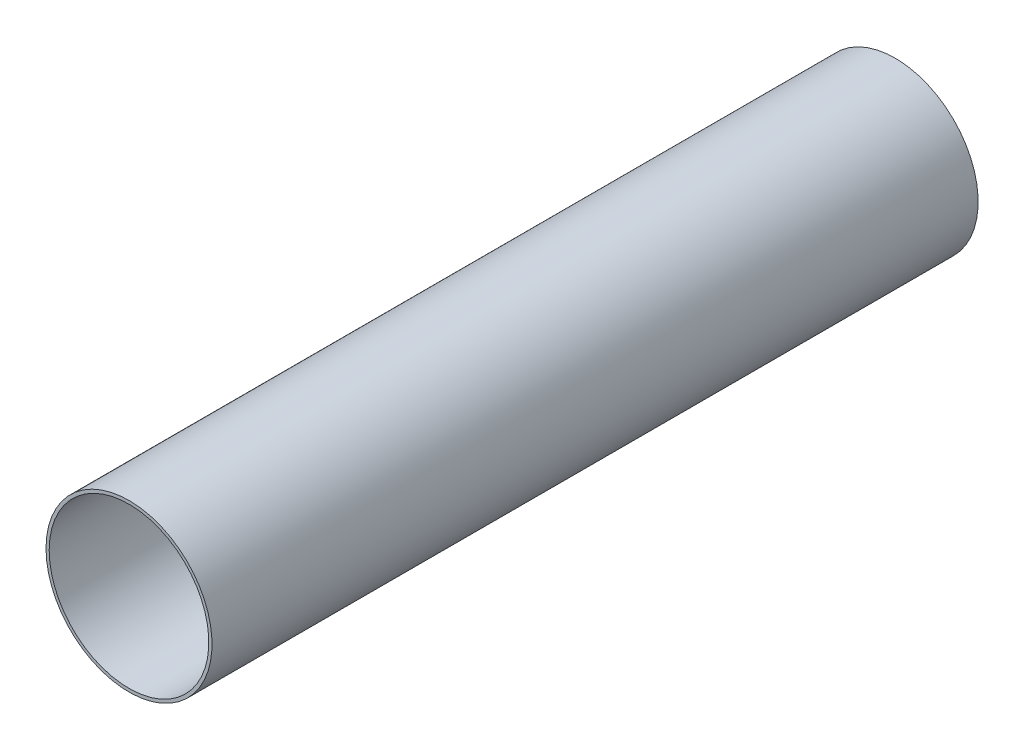
ISO-10303-21;
HEADER;
FILE_DESCRIPTION(('STEP AP214'),'2;1');
FILE_NAME('part.step','',(''),(''),'','','');
FILE_SCHEMA(('AUTOMOTIVE_DESIGN { 1 0 10303 214 1 1 1 1 }'));
ENDSEC;
DATA;
#1=APPLICATION_CONTEXT('core data for automotive mechanical design processes');
#2=APPLICATION_PROTOCOL_DEFINITION('international standard','automotive_design',2000,#1);
#3=PRODUCT_CONTEXT('',#1,'mechanical');
#4=PRODUCT('Part','Part','',(#3));
#5=PRODUCT_RELATED_PRODUCT_CATEGORY('part','',(#4));
#6=PRODUCT_DEFINITION_FORMATION('','',#4);
#7=PRODUCT_DEFINITION_CONTEXT('part definition',#1,'design');
#8=PRODUCT_DEFINITION('design','',#6,#7);
#9=PRODUCT_DEFINITION_SHAPE('','',#8);
#10=(LENGTH_UNIT() NAMED_UNIT(*) SI_UNIT(.MILLI.,.METRE.));
#11=(NAMED_UNIT(*) PLANE_ANGLE_UNIT() SI_UNIT($,.RADIAN.));
#12=(NAMED_UNIT(*) SI_UNIT($,.STERADIAN.) SOLID_ANGLE_UNIT());
#13=UNCERTAINTY_MEASURE_WITH_UNIT(LENGTH_MEASURE(1.E-05),#10,'distance_accuracy_value','');
#14=(GEOMETRIC_REPRESENTATION_CONTEXT(3) GLOBAL_UNCERTAINTY_ASSIGNED_CONTEXT((#13)) GLOBAL_UNIT_ASSIGNED_CONTEXT((#10,
#11,#12)) REPRESENTATION_CONTEXT('',''));
#15=CARTESIAN_POINT('',(0.,0.,0.));
#16=DIRECTION('',(0.,0.,1.));
#17=DIRECTION('',(1.,0.,0.));
#18=AXIS2_PLACEMENT_3D('',#15,#16,#17);
#19=CARTESIAN_POINT('',(0.,0.,60.));
#20=DIRECTION('',(0.,0.,1.));
#21=DIRECTION('',(1.,0.,0.));
#22=AXIS2_PLACEMENT_3D('',#19,#20,#21);
#23=PLANE('',#22);
#24=CARTESIAN_POINT('',(0.,0.,60.));
#25=DIRECTION('',(0.,0.,1.));
#26=DIRECTION('',(1.,0.,0.));
#27=AXIS2_PLACEMENT_3D('',#24,#25,#26);
#28=CIRCLE('',#27,13.);
#29=CARTESIAN_POINT('',(-13.,0.,60.));
#30=VERTEX_POINT('',#29);
#31=EDGE_CURVE('E10',#30,#30,#28,.T.);
#32=ORIENTED_EDGE('',*,*,#31,.T.);
#33=EDGE_LOOP('',(#32));
#34=FACE_BOUND('',#33,.T.);
#35=CARTESIAN_POINT('',(0.,0.,60.));
#36=DIRECTION('',(0.,0.,1.));
#37=DIRECTION('',(1.,0.,0.));
#38=AXIS2_PLACEMENT_3D('',#35,#36,#37);
#39=CIRCLE('',#38,12.5);
#40=CARTESIAN_POINT('',(-12.5,0.,60.));
#41=VERTEX_POINT('',#40);
#42=EDGE_CURVE('E52',#41,#41,#39,.T.);
#43=ORIENTED_EDGE('',*,*,#42,.F.);
#44=EDGE_LOOP('',(#43));
#45=FACE_BOUND('',#44,.T.);
#46=ADVANCED_FACE('F39',(#34,#45),#23,.T.);
#47=CARTESIAN_POINT('',(0.,0.,-60.));
#48=DIRECTION('',(0.,0.,1.));
#49=DIRECTION('',(1.,0.,0.));
#50=AXIS2_PLACEMENT_3D('',#47,#48,#49);
#51=PLANE('',#50);
#52=CARTESIAN_POINT('',(0.,0.,-60.));
#53=DIRECTION('',(0.,0.,1.));
#54=DIRECTION('',(1.,0.,0.));
#55=AXIS2_PLACEMENT_3D('',#52,#53,#54);
#56=CIRCLE('',#55,13.);
#57=CARTESIAN_POINT('',(-13.,0.,-60.));
#58=VERTEX_POINT('',#57);
#59=EDGE_CURVE('E43',#58,#58,#56,.T.);
#60=ORIENTED_EDGE('',*,*,#59,.F.);
#61=EDGE_LOOP('',(#60));
#62=FACE_BOUND('',#61,.T.);
#63=CARTESIAN_POINT('',(0.,0.,-60.));
#64=DIRECTION('',(0.,0.,1.));
#65=DIRECTION('',(1.,0.,0.));
#66=AXIS2_PLACEMENT_3D('',#63,#64,#65);
#67=CIRCLE('',#66,12.5);
#68=CARTESIAN_POINT('',(-12.5,0.,-60.));
#69=VERTEX_POINT('',#68);
#70=EDGE_CURVE('E54',#69,#69,#67,.T.);
#71=ORIENTED_EDGE('',*,*,#70,.T.);
#72=EDGE_LOOP('',(#71));
#73=FACE_BOUND('',#72,.T.);
#74=ADVANCED_FACE('F66',(#62,#73),#51,.F.);
#75=CARTESIAN_POINT('',(0.,0.,60.));
#76=DIRECTION('',(0.,0.,-1.));
#77=DIRECTION('',(-1.,0.,0.));
#78=AXIS2_PLACEMENT_3D('',#75,#76,#77);
#79=CYLINDRICAL_SURFACE('',#78,13.);
#80=CARTESIAN_POINT('',(-13.,0.,60.));
#81=CARTESIAN_POINT('',(-13.,0.,58.75));
#82=CARTESIAN_POINT('',(-13.,0.,57.5));
#83=CARTESIAN_POINT('',(-13.,0.,55.));
#84=CARTESIAN_POINT('',(-13.,0.,53.75));
#85=CARTESIAN_POINT('',(-13.,0.,51.25));
#86=CARTESIAN_POINT('',(-13.,0.,50.));
#87=CARTESIAN_POINT('',(-13.,0.,47.5));
#88=CARTESIAN_POINT('',(-13.,0.,46.25));
#89=CARTESIAN_POINT('',(-13.,0.,43.75));
#90=CARTESIAN_POINT('',(-13.,0.,42.5));
#91=CARTESIAN_POINT('',(-13.,0.,40.));
#92=CARTESIAN_POINT('',(-13.,0.,38.75));
#93=CARTESIAN_POINT('',(-13.,0.,36.25));
#94=CARTESIAN_POINT('',(-13.,0.,35.));
#95=CARTESIAN_POINT('',(-13.,0.,32.5));
#96=CARTESIAN_POINT('',(-13.,0.,31.25));
#97=CARTESIAN_POINT('',(-13.,0.,28.75));
#98=CARTESIAN_POINT('',(-13.,0.,27.5));
#99=CARTESIAN_POINT('',(-13.,0.,25.));
#100=CARTESIAN_POINT('',(-13.,0.,23.75));
#101=CARTESIAN_POINT('',(-13.,0.,21.25));
#102=CARTESIAN_POINT('',(-13.,0.,20.));
#103=CARTESIAN_POINT('',(-13.,0.,17.5));
#104=CARTESIAN_POINT('',(-13.,0.,16.25));
#105=CARTESIAN_POINT('',(-13.,0.,13.75));
#106=CARTESIAN_POINT('',(-13.,0.,12.5));
#107=CARTESIAN_POINT('',(-13.,0.,9.99999999999999));
#108=CARTESIAN_POINT('',(-13.,0.,8.74999999999999));
#109=CARTESIAN_POINT('',(-13.,0.,6.24999999999999));
#110=CARTESIAN_POINT('',(-13.,0.,4.99999999999999));
#111=CARTESIAN_POINT('',(-13.,0.,2.5));
#112=CARTESIAN_POINT('',(-13.,0.,1.24999999999999));
#113=CARTESIAN_POINT('',(-13.,0.,-1.25));
#114=CARTESIAN_POINT('',(-13.,0.,-2.5));
#115=CARTESIAN_POINT('',(-13.,0.,-5.));
#116=CARTESIAN_POINT('',(-13.,0.,-6.25));
#117=CARTESIAN_POINT('',(-13.,0.,-8.75));
#118=CARTESIAN_POINT('',(-13.,0.,-9.99999999999999));
#119=CARTESIAN_POINT('',(-13.,0.,-12.5));
#120=CARTESIAN_POINT('',(-13.,0.,-13.75));
#121=CARTESIAN_POINT('',(-13.,0.,-16.25));
#122=CARTESIAN_POINT('',(-13.,0.,-17.5));
#123=CARTESIAN_POINT('',(-13.,0.,-20.));
#124=CARTESIAN_POINT('',(-13.,0.,-21.25));
#125=CARTESIAN_POINT('',(-13.,0.,-23.75));
#126=CARTESIAN_POINT('',(-13.,0.,-25.));
#127=CARTESIAN_POINT('',(-13.,0.,-27.5));
#128=CARTESIAN_POINT('',(-13.,0.,-28.75));
#129=CARTESIAN_POINT('',(-13.,0.,-31.25));
#130=CARTESIAN_POINT('',(-13.,0.,-32.5));
#131=CARTESIAN_POINT('',(-13.,0.,-35.));
#132=CARTESIAN_POINT('',(-13.,0.,-36.25));
#133=CARTESIAN_POINT('',(-13.,0.,-38.75));
#134=CARTESIAN_POINT('',(-13.,0.,-40.));
#135=CARTESIAN_POINT('',(-13.,0.,-42.5));
#136=CARTESIAN_POINT('',(-13.,0.,-43.75));
#137=CARTESIAN_POINT('',(-13.,0.,-46.25));
#138=CARTESIAN_POINT('',(-13.,0.,-47.5));
#139=CARTESIAN_POINT('',(-13.,0.,-50.));
#140=CARTESIAN_POINT('',(-13.,0.,-51.25));
#141=CARTESIAN_POINT('',(-13.,0.,-53.75));
#142=CARTESIAN_POINT('',(-13.,0.,-55.));
#143=CARTESIAN_POINT('',(-13.,0.,-57.5));
#144=CARTESIAN_POINT('',(-13.,0.,-58.75));
#145=CARTESIAN_POINT('',(-13.,0.,-60.));
#146=B_SPLINE_CURVE_WITH_KNOTS('',3,(#80,#81,#82,#83,#84,#85,#86,#87,#88,#89,#90,#91,#92,#93,
#94,#95,#96,#97,#98,#99,#100,#101,#102,#103,#104,#105,#106,#107,#108,#109,#110,#111,#112,#113,
#114,#115,#116,#117,#118,#119,#120,#121,#122,#123,#124,#125,#126,#127,#128,#129,#130,#131,#132,
#133,#134,#135,#136,#137,#138,#139,#140,#141,#142,#143,#144,#145),.UNSPECIFIED.,.F.,.F.,(4,2,2,
2,2,2,2,2,2,2,2,2,2,2,2,2,2,2,2,2,2,2,2,2,2,2,2,2,2,2,2,2,4),(0.,3.75,7.49999999999999,11.25,
15.,18.75,22.5,26.25,30.,33.75,37.5,41.25,45.,48.75,52.5,56.25,60.,63.75,67.5,71.25,75.,78.75,
82.5,86.25,90.,93.75,97.5,101.25,105.,108.75,112.5,116.25,120.),.UNSPECIFIED.);
#147=EDGE_CURVE('BSEAM41',#30,#58,#146,.T.);
#148=ORIENTED_EDGE('',*,*,#31,.F.);
#149=ORIENTED_EDGE('',*,*,#59,.T.);
#150=ORIENTED_EDGE('',*,*,#147,.T.);
#151=ORIENTED_EDGE('',*,*,#147,.F.);
#152=EDGE_LOOP('',(#148,#150,#149,#151));
#153=FACE_BOUND('',#152,.T.);
#154=ADVANCED_FACE('F41',(#153),#79,.T.);
#155=CARTESIAN_POINT('',(0.,0.,60.));
#156=DIRECTION('',(0.,0.,-1.));
#157=DIRECTION('',(-1.,0.,0.));
#158=AXIS2_PLACEMENT_3D('',#155,#156,#157);
#159=CYLINDRICAL_SURFACE('',#158,12.5);
#160=CARTESIAN_POINT('',(-12.5,0.,60.));
#161=CARTESIAN_POINT('',(-12.5,0.,58.75));
#162=CARTESIAN_POINT('',(-12.5,0.,57.5));
#163=CARTESIAN_POINT('',(-12.5,0.,55.));
#164=CARTESIAN_POINT('',(-12.5,0.,53.75));
#165=CARTESIAN_POINT('',(-12.5,0.,51.25));
#166=CARTESIAN_POINT('',(-12.5,0.,50.));
#167=CARTESIAN_POINT('',(-12.5,0.,47.5));
#168=CARTESIAN_POINT('',(-12.5,0.,46.25));
#169=CARTESIAN_POINT('',(-12.5,0.,43.75));
#170=CARTESIAN_POINT('',(-12.5,0.,42.5));
#171=CARTESIAN_POINT('',(-12.5,0.,40.));
#172=CARTESIAN_POINT('',(-12.5,0.,38.75));
#173=CARTESIAN_POINT('',(-12.5,0.,36.25));
#174=CARTESIAN_POINT('',(-12.5,0.,35.));
#175=CARTESIAN_POINT('',(-12.5,0.,32.5));
#176=CARTESIAN_POINT('',(-12.5,0.,31.25));
#177=CARTESIAN_POINT('',(-12.5,0.,28.75));
#178=CARTESIAN_POINT('',(-12.5,0.,27.5));
#179=CARTESIAN_POINT('',(-12.5,0.,25.));
#180=CARTESIAN_POINT('',(-12.5,0.,23.75));
#181=CARTESIAN_POINT('',(-12.5,0.,21.25));
#182=CARTESIAN_POINT('',(-12.5,0.,20.));
#183=CARTESIAN_POINT('',(-12.5,0.,17.5));
#184=CARTESIAN_POINT('',(-12.5,0.,16.25));
#185=CARTESIAN_POINT('',(-12.5,0.,13.75));
#186=CARTESIAN_POINT('',(-12.5,0.,12.5));
#187=CARTESIAN_POINT('',(-12.5,0.,9.99999999999999));
#188=CARTESIAN_POINT('',(-12.5,0.,8.74999999999999));
#189=CARTESIAN_POINT('',(-12.5,0.,6.24999999999999));
#190=CARTESIAN_POINT('',(-12.5,0.,4.99999999999999));
#191=CARTESIAN_POINT('',(-12.5,0.,2.5));
#192=CARTESIAN_POINT('',(-12.5,0.,1.24999999999999));
#193=CARTESIAN_POINT('',(-12.5,0.,-1.25));
#194=CARTESIAN_POINT('',(-12.5,0.,-2.5));
#195=CARTESIAN_POINT('',(-12.5,0.,-5.));
#196=CARTESIAN_POINT('',(-12.5,0.,-6.25));
#197=CARTESIAN_POINT('',(-12.5,0.,-8.75));
#198=CARTESIAN_POINT('',(-12.5,0.,-9.99999999999999));
#199=CARTESIAN_POINT('',(-12.5,0.,-12.5));
#200=CARTESIAN_POINT('',(-12.5,0.,-13.75));
#201=CARTESIAN_POINT('',(-12.5,0.,-16.25));
#202=CARTESIAN_POINT('',(-12.5,0.,-17.5));
#203=CARTESIAN_POINT('',(-12.5,0.,-20.));
#204=CARTESIAN_POINT('',(-12.5,0.,-21.25));
#205=CARTESIAN_POINT('',(-12.5,0.,-23.75));
#206=CARTESIAN_POINT('',(-12.5,0.,-25.));
#207=CARTESIAN_POINT('',(-12.5,0.,-27.5));
#208=CARTESIAN_POINT('',(-12.5,0.,-28.75));
#209=CARTESIAN_POINT('',(-12.5,0.,-31.25));
#210=CARTESIAN_POINT('',(-12.5,0.,-32.5));
#211=CARTESIAN_POINT('',(-12.5,0.,-35.));
#212=CARTESIAN_POINT('',(-12.5,0.,-36.25));
#213=CARTESIAN_POINT('',(-12.5,0.,-38.75));
#214=CARTESIAN_POINT('',(-12.5,0.,-40.));
#215=CARTESIAN_POINT('',(-12.5,0.,-42.5));
#216=CARTESIAN_POINT('',(-12.5,0.,-43.75));
#217=CARTESIAN_POINT('',(-12.5,0.,-46.25));
#218=CARTESIAN_POINT('',(-12.5,0.,-47.5));
#219=CARTESIAN_POINT('',(-12.5,0.,-50.));
#220=CARTESIAN_POINT('',(-12.5,0.,-51.25));
#221=CARTESIAN_POINT('',(-12.5,0.,-53.75));
#222=CARTESIAN_POINT('',(-12.5,0.,-55.));
#223=CARTESIAN_POINT('',(-12.5,0.,-57.5));
#224=CARTESIAN_POINT('',(-12.5,0.,-58.75));
#225=CARTESIAN_POINT('',(-12.5,0.,-60.));
#226=B_SPLINE_CURVE_WITH_KNOTS('',3,(#160,#161,#162,#163,#164,#165,#166,#167,#168,#169,#170,
#171,#172,#173,#174,#175,#176,#177,#178,#179,#180,#181,#182,#183,#184,#185,#186,#187,#188,#189,
#190,#191,#192,#193,#194,#195,#196,#197,#198,#199,#200,#201,#202,#203,#204,#205,#206,#207,#208,
#209,#210,#211,#212,#213,#214,#215,#216,#217,#218,#219,#220,#221,#222,#223,#224,#225),
.UNSPECIFIED.,.F.,.F.,(4,2,2,2,2,2,2,2,2,2,2,2,2,2,2,2,2,2,2,2,2,2,2,2,2,2,2,2,2,2,2,2,4),(0.,
3.75,7.49999999999999,11.25,15.,18.75,22.5,26.25,30.,33.75,37.5,41.25,45.,48.75,52.5,56.25,60.,
63.75,67.5,71.25,75.,78.75,82.5,86.25,90.,93.75,97.5,101.25,105.,108.75,112.5,116.25,120.),.UNSPECIFIED.);
#227=EDGE_CURVE('BSEAM62',#41,#69,#226,.T.);
#228=ORIENTED_EDGE('',*,*,#42,.T.);
#229=ORIENTED_EDGE('',*,*,#70,.F.);
#230=ORIENTED_EDGE('',*,*,#227,.T.);
#231=ORIENTED_EDGE('',*,*,#227,.F.);
#232=EDGE_LOOP('',(#228,#230,#229,#231));
#233=FACE_BOUND('',#232,.T.);
#234=ADVANCED_FACE('F62',(#233),#159,.F.);
#235=CLOSED_SHELL('',(#46,#74,#154,#234));
#236=MANIFOLD_SOLID_BREP('B2',#235);
#237=ADVANCED_BREP_SHAPE_REPRESENTATION('',(#18,#236),#14);
#238=SHAPE_DEFINITION_REPRESENTATION(#9,#237);
ENDSEC;
END-ISO-10303-21;
